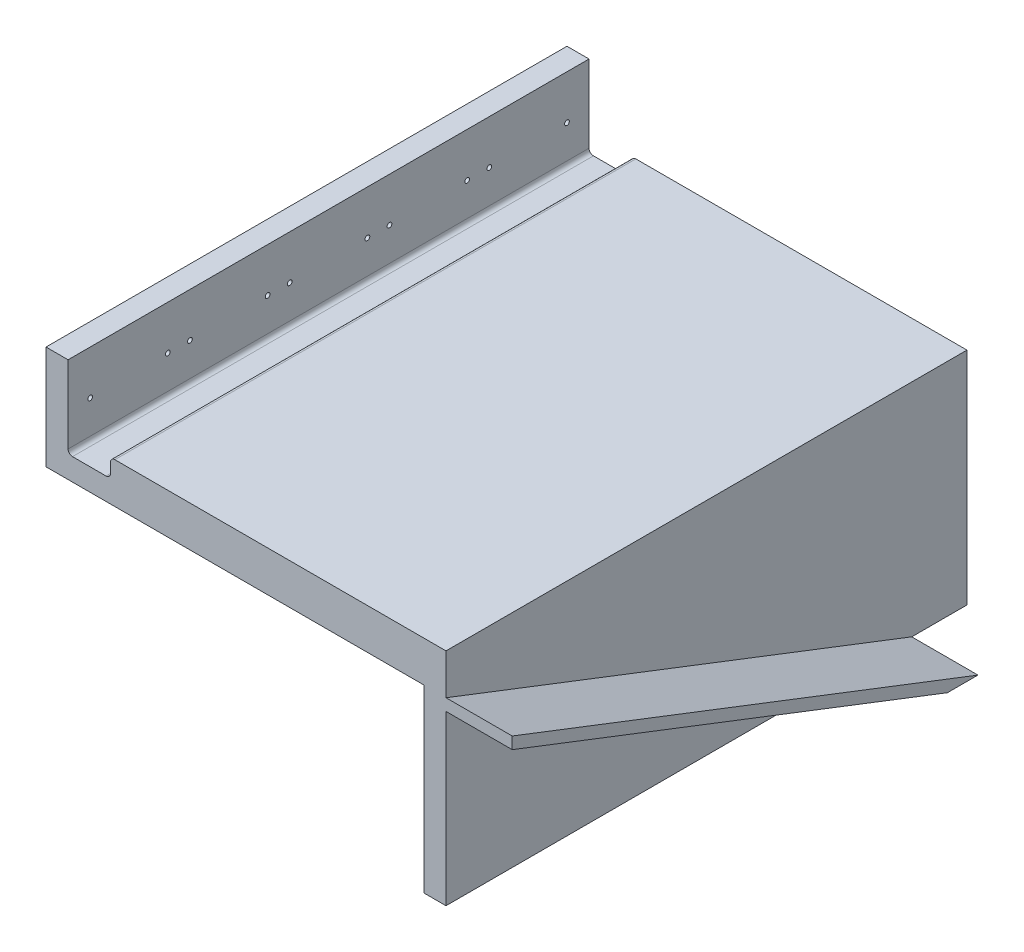
ISO-10303-21;
HEADER;
FILE_DESCRIPTION(('STEP AP214'),'2;1');
FILE_NAME('part.step','',(''),(''),'','','');
FILE_SCHEMA(('AUTOMOTIVE_DESIGN { 1 0 10303 214 1 1 1 1 }'));
ENDSEC;
DATA;
#1=APPLICATION_CONTEXT('core data for automotive mechanical design processes');
#2=APPLICATION_PROTOCOL_DEFINITION('international standard','automotive_design',2000,#1);
#3=PRODUCT_CONTEXT('',#1,'mechanical');
#4=PRODUCT('Part','Part','',(#3));
#5=PRODUCT_RELATED_PRODUCT_CATEGORY('part','',(#4));
#6=PRODUCT_DEFINITION_FORMATION('','',#4);
#7=PRODUCT_DEFINITION_CONTEXT('part definition',#1,'design');
#8=PRODUCT_DEFINITION('design','',#6,#7);
#9=PRODUCT_DEFINITION_SHAPE('','',#8);
#10=(LENGTH_UNIT() NAMED_UNIT(*) SI_UNIT(.MILLI.,.METRE.));
#11=(NAMED_UNIT(*) PLANE_ANGLE_UNIT() SI_UNIT($,.RADIAN.));
#12=(NAMED_UNIT(*) SI_UNIT($,.STERADIAN.) SOLID_ANGLE_UNIT());
#13=UNCERTAINTY_MEASURE_WITH_UNIT(LENGTH_MEASURE(1.E-05),#10,'distance_accuracy_value','');
#14=(GEOMETRIC_REPRESENTATION_CONTEXT(3) GLOBAL_UNCERTAINTY_ASSIGNED_CONTEXT((#13)) GLOBAL_UNIT_ASSIGNED_CONTEXT((#10,
#11,#12)) REPRESENTATION_CONTEXT('',''));
#15=CARTESIAN_POINT('',(0.,0.,0.));
#16=DIRECTION('',(0.,0.,1.));
#17=DIRECTION('',(1.,0.,0.));
#18=AXIS2_PLACEMENT_3D('',#15,#16,#17);
#19=CARTESIAN_POINT('',(171.2,-24.7873130780648,236.));
#20=DIRECTION('',(-1.,0.,0.));
#21=DIRECTION('',(0.,0.,1.));
#22=AXIS2_PLACEMENT_3D('',#19,#20,#21);
#23=PLANE('',#22);
#24=DIRECTION('',(0.,-0.360696463988093,-0.932683258596661));
#25=VECTOR('',#24,1.);
#26=CARTESIAN_POINT('',(171.2,-30.1481898322194,236.));
#27=LINE('',#26,#25);
#28=CARTESIAN_POINT('',(171.2,-30.1481898322194,236.));
#29=VERTEX_POINT('',#28);
#30=CARTESIAN_POINT('',(171.2,-106.387313078065,38.8620710187086));
#31=VERTEX_POINT('',#30);
#32=EDGE_CURVE('E191',#29,#31,#27,.T.);
#33=ORIENTED_EDGE('',*,*,#32,.F.);
#34=DIRECTION('',(0.,1.,0.));
#35=VECTOR('',#34,1.);
#36=CARTESIAN_POINT('',(171.2,-24.7873130780648,236.));
#37=LINE('',#36,#35);
#38=CARTESIAN_POINT('',(171.2,-106.387313078065,236.));
#39=VERTEX_POINT('',#38);
#40=EDGE_CURVE('E291',#39,#29,#37,.T.);
#41=ORIENTED_EDGE('',*,*,#40,.F.);
#42=DIRECTION('',(0.,0.,-1.));
#43=VECTOR('',#42,1.);
#44=CARTESIAN_POINT('',(171.2,-106.387313078065,236.));
#45=LINE('',#44,#43);
#46=EDGE_CURVE('E72',#39,#31,#45,.T.);
#47=ORIENTED_EDGE('',*,*,#46,.T.);
#48=EDGE_LOOP('',(#33,#41,#47));
#49=FACE_BOUND('',#48,.T.);
#50=ADVANCED_FACE('F48',(#49),#23,.F.);
#51=DIRECTION('',(0.,0.360696463988093,0.932683258596661));
#52=VECTOR('',#51,1.);
#53=CARTESIAN_POINT('',(171.2,-24.7873130780648,236.));
#54=LINE('',#53,#52);
#55=CARTESIAN_POINT('',(171.2,-106.387313078065,25.));
#56=VERTEX_POINT('',#55);
#57=CARTESIAN_POINT('',(171.2,-24.7873130780648,236.));
#58=VERTEX_POINT('',#57);
#59=EDGE_CURVE('E64',#56,#58,#54,.T.);
#60=ORIENTED_EDGE('',*,*,#59,.F.);
#61=CARTESIAN_POINT('',(171.2,-106.387313078065,0.));
#62=VERTEX_POINT('',#61);
#63=EDGE_CURVE('E211',#56,#62,#45,.T.);
#64=ORIENTED_EDGE('',*,*,#63,.T.);
#65=DIRECTION('',(0.,1.,0.));
#66=VECTOR('',#65,1.);
#67=CARTESIAN_POINT('',(171.2,-24.7873130780648,0.));
#68=LINE('',#67,#66);
#69=CARTESIAN_POINT('',(171.2,-6.38731307806478,0.));
#70=VERTEX_POINT('',#69);
#71=EDGE_CURVE('E318',#62,#70,#68,.T.);
#72=ORIENTED_EDGE('',*,*,#71,.T.);
#73=DIRECTION('',(0.,0.,-1.));
#74=VECTOR('',#73,1.);
#75=CARTESIAN_POINT('',(171.2,-6.38731307806478,236.));
#76=LINE('',#75,#74);
#77=CARTESIAN_POINT('',(171.2,-6.38731307806478,236.));
#78=VERTEX_POINT('',#77);
#79=EDGE_CURVE('E306',#78,#70,#76,.T.);
#80=ORIENTED_EDGE('',*,*,#79,.F.);
#81=EDGE_CURVE('E290',#58,#78,#37,.T.);
#82=ORIENTED_EDGE('',*,*,#81,.F.);
#83=EDGE_LOOP('',(#60,#64,#72,#80,#82));
#84=FACE_BOUND('',#83,.T.);
#85=ADVANCED_FACE('F469',(#84),#23,.F.);
#86=CARTESIAN_POINT('',(0.,0.,236.));
#87=DIRECTION('',(-1.,0.,0.));
#88=DIRECTION('',(0.,0.,1.));
#89=AXIS2_PLACEMENT_3D('',#86,#87,#88);
#90=PLANE('',#89);
#91=CARTESIAN_POINT('',(0.,2.2126869219352,10.));
#92=DIRECTION('',(-1.,0.,0.));
#93=DIRECTION('',(0.,0.,1.));
#94=AXIS2_PLACEMENT_3D('',#91,#92,#93);
#95=CIRCLE('',#94,1.075);
#96=CARTESIAN_POINT('',(0.,2.2126869219352,11.075));
#97=VERTEX_POINT('',#96);
#98=EDGE_CURVE('E271',#97,#97,#95,.T.);
#99=ORIENTED_EDGE('',*,*,#98,.T.);
#100=EDGE_LOOP('',(#99));
#101=FACE_BOUND('',#100,.T.);
#102=CARTESIAN_POINT('',(0.,2.21268692193393,190.8));
#103=DIRECTION('',(-1.,0.,0.));
#104=DIRECTION('',(0.,0.,1.));
#105=AXIS2_PLACEMENT_3D('',#102,#103,#104);
#106=CIRCLE('',#105,1.07500000000001);
#107=CARTESIAN_POINT('',(0.,2.21268692193393,191.875));
#108=VERTEX_POINT('',#107);
#109=EDGE_CURVE('E266',#108,#108,#106,.T.);
#110=ORIENTED_EDGE('',*,*,#109,.T.);
#111=EDGE_LOOP('',(#110));
#112=FACE_BOUND('',#111,.T.);
#113=CARTESIAN_POINT('',(0.,2.21268692193425,180.8));
#114=DIRECTION('',(-1.,0.,0.));
#115=DIRECTION('',(0.,0.,1.));
#116=AXIS2_PLACEMENT_3D('',#113,#114,#115);
#117=CIRCLE('',#116,1.07500000000001);
#118=CARTESIAN_POINT('',(0.,2.21268692193425,181.875));
#119=VERTEX_POINT('',#118);
#120=EDGE_CURVE('E261',#119,#119,#117,.T.);
#121=ORIENTED_EDGE('',*,*,#120,.T.);
#122=EDGE_LOOP('',(#121));
#123=FACE_BOUND('',#122,.T.);
#124=CARTESIAN_POINT('',(0.,2.21268692193425,145.6));
#125=DIRECTION('',(-1.,0.,0.));
#126=DIRECTION('',(0.,0.,1.));
#127=AXIS2_PLACEMENT_3D('',#124,#125,#126);
#128=CIRCLE('',#127,1.07500000000001);
#129=CARTESIAN_POINT('',(0.,2.21268692193425,146.675));
#130=VERTEX_POINT('',#129);
#131=EDGE_CURVE('E256',#130,#130,#128,.T.);
#132=ORIENTED_EDGE('',*,*,#131,.T.);
#133=EDGE_LOOP('',(#132));
#134=FACE_BOUND('',#133,.T.);
#135=CARTESIAN_POINT('',(0.,2.21268692193457,100.4));
#136=DIRECTION('',(-1.,0.,0.));
#137=DIRECTION('',(0.,0.,1.));
#138=AXIS2_PLACEMENT_3D('',#135,#136,#137);
#139=CIRCLE('',#138,1.07499999999999);
#140=CARTESIAN_POINT('',(0.,2.21268692193457,101.475));
#141=VERTEX_POINT('',#140);
#142=EDGE_CURVE('E251',#141,#141,#139,.T.);
#143=ORIENTED_EDGE('',*,*,#142,.T.);
#144=EDGE_LOOP('',(#143));
#145=FACE_BOUND('',#144,.T.);
#146=CARTESIAN_POINT('',(0.,2.21268692193488,90.4));
#147=DIRECTION('',(-1.,0.,0.));
#148=DIRECTION('',(0.,0.,1.));
#149=AXIS2_PLACEMENT_3D('',#146,#147,#148);
#150=CIRCLE('',#149,1.07499999999999);
#151=CARTESIAN_POINT('',(0.,2.21268692193488,91.475));
#152=VERTEX_POINT('',#151);
#153=EDGE_CURVE('E246',#152,#152,#150,.T.);
#154=ORIENTED_EDGE('',*,*,#153,.T.);
#155=EDGE_LOOP('',(#154));
#156=FACE_BOUND('',#155,.T.);
#157=CARTESIAN_POINT('',(0.,2.21268692193457,135.6));
#158=DIRECTION('',(-1.,0.,0.));
#159=DIRECTION('',(0.,0.,1.));
#160=AXIS2_PLACEMENT_3D('',#157,#158,#159);
#161=CIRCLE('',#160,1.07500000000001);
#162=CARTESIAN_POINT('',(0.,2.21268692193457,136.675));
#163=VERTEX_POINT('',#162);
#164=EDGE_CURVE('E241',#163,#163,#161,.T.);
#165=ORIENTED_EDGE('',*,*,#164,.T.);
#166=EDGE_LOOP('',(#165));
#167=FACE_BOUND('',#166,.T.);
#168=CARTESIAN_POINT('',(0.,2.21268692193488,55.2));
#169=DIRECTION('',(-1.,0.,0.));
#170=DIRECTION('',(0.,0.,1.));
#171=AXIS2_PLACEMENT_3D('',#168,#169,#170);
#172=CIRCLE('',#171,1.075);
#173=CARTESIAN_POINT('',(0.,2.21268692193488,56.275));
#174=VERTEX_POINT('',#173);
#175=EDGE_CURVE('E236',#174,#174,#172,.T.);
#176=ORIENTED_EDGE('',*,*,#175,.T.);
#177=EDGE_LOOP('',(#176));
#178=FACE_BOUND('',#177,.T.);
#179=CARTESIAN_POINT('',(0.,2.2126869219352,45.2));
#180=DIRECTION('',(-1.,0.,0.));
#181=DIRECTION('',(0.,0.,1.));
#182=AXIS2_PLACEMENT_3D('',#179,#180,#181);
#183=CIRCLE('',#182,1.075);
#184=CARTESIAN_POINT('',(0.,2.2126869219352,46.275));
#185=VERTEX_POINT('',#184);
#186=EDGE_CURVE('E231',#185,#185,#183,.T.);
#187=ORIENTED_EDGE('',*,*,#186,.T.);
#188=EDGE_LOOP('',(#187));
#189=FACE_BOUND('',#188,.T.);
#190=CARTESIAN_POINT('',(0.,2.21268692193393,226.));
#191=DIRECTION('',(-1.,0.,0.));
#192=DIRECTION('',(0.,0.,1.));
#193=AXIS2_PLACEMENT_3D('',#190,#191,#192);
#194=CIRCLE('',#193,1.07500000000001);
#195=CARTESIAN_POINT('',(0.,2.21268692193393,227.075));
#196=VERTEX_POINT('',#195);
#197=EDGE_CURVE('E226',#196,#196,#194,.T.);
#198=ORIENTED_EDGE('',*,*,#197,.T.);
#199=EDGE_LOOP('',(#198));
#200=FACE_BOUND('',#199,.T.);
#201=DIRECTION('',(0.,1.,0.));
#202=VECTOR('',#201,1.);
#203=CARTESIAN_POINT('',(0.,-14.7873130780648,236.));
#204=LINE('',#203,#202);
#205=CARTESIAN_POINT('',(0.,-12.7873130780648,236.));
#206=VERTEX_POINT('',#205);
#207=CARTESIAN_POINT('',(0.,22.2126869219352,236.));
#208=VERTEX_POINT('',#207);
#209=EDGE_CURVE('E276',#206,#208,#204,.T.);
#210=ORIENTED_EDGE('',*,*,#209,.F.);
#211=DIRECTION('',(0.,0.,-1.));
#212=VECTOR('',#211,1.);
#213=CARTESIAN_POINT('',(0.,-12.7873130780648,0.));
#214=LINE('',#213,#212);
#215=CARTESIAN_POINT('',(0.,-12.7873130780648,0.));
#216=VERTEX_POINT('',#215);
#217=EDGE_CURVE('E401',#206,#216,#214,.T.);
#218=ORIENTED_EDGE('',*,*,#217,.T.);
#219=DIRECTION('',(0.,1.,0.));
#220=VECTOR('',#219,1.);
#221=CARTESIAN_POINT('',(0.,0.,0.));
#222=LINE('',#221,#220);
#223=CARTESIAN_POINT('',(0.,22.2126869219352,0.));
#224=VERTEX_POINT('',#223);
#225=EDGE_CURVE('E275',#216,#224,#222,.T.);
#226=ORIENTED_EDGE('',*,*,#225,.T.);
#227=DIRECTION('',(0.,0.,-1.));
#228=VECTOR('',#227,1.);
#229=CARTESIAN_POINT('',(0.,22.2126869219352,236.));
#230=LINE('',#229,#228);
#231=EDGE_CURVE('E342',#208,#224,#230,.T.);
#232=ORIENTED_EDGE('',*,*,#231,.F.);
#233=EDGE_LOOP('',(#210,#218,#226,#232));
#234=FACE_BOUND('',#233,.T.);
#235=ADVANCED_FACE('F429',(#101,#112,#123,#134,#145,#156,#167,#178,#189,#200,#234),#90,.F.);
#236=CARTESIAN_POINT('',(0.,22.2126869219352,236.));
#237=DIRECTION('',(0.,-1.,0.));
#238=DIRECTION('',(0.,0.,-1.));
#239=AXIS2_PLACEMENT_3D('',#236,#237,#238);
#240=PLANE('',#239);
#241=DIRECTION('',(-1.,0.,0.));
#242=VECTOR('',#241,1.);
#243=CARTESIAN_POINT('',(0.,22.2126869219352,0.));
#244=LINE('',#243,#242);
#245=CARTESIAN_POINT('',(-10.,22.2126869219352,0.));
#246=VERTEX_POINT('',#245);
#247=EDGE_CURVE('E309',#224,#246,#244,.T.);
#248=ORIENTED_EDGE('',*,*,#247,.T.);
#249=DIRECTION('',(0.,0.,-1.));
#250=VECTOR('',#249,1.);
#251=CARTESIAN_POINT('',(-10.,22.2126869219352,236.));
#252=LINE('',#251,#250);
#253=CARTESIAN_POINT('',(-10.,22.2126869219352,236.));
#254=VERTEX_POINT('',#253);
#255=EDGE_CURVE('E338',#254,#246,#252,.T.);
#256=ORIENTED_EDGE('',*,*,#255,.F.);
#257=DIRECTION('',(-1.,0.,0.));
#258=VECTOR('',#257,1.);
#259=CARTESIAN_POINT('',(0.,22.2126869219352,236.));
#260=LINE('',#259,#258);
#261=EDGE_CURVE('E279',#208,#254,#260,.T.);
#262=ORIENTED_EDGE('',*,*,#261,.F.);
#263=ORIENTED_EDGE('',*,*,#231,.T.);
#264=EDGE_LOOP('',(#248,#256,#262,#263));
#265=FACE_BOUND('',#264,.T.);
#266=ADVANCED_FACE('F433',(#265),#240,.F.);
#267=CARTESIAN_POINT('',(-10.,22.2126869219352,236.));
#268=DIRECTION('',(1.,0.,0.));
#269=DIRECTION('',(0.,1.,0.));
#270=AXIS2_PLACEMENT_3D('',#267,#268,#269);
#271=PLANE('',#270);
#272=CARTESIAN_POINT('',(-9.99999999999999,2.2126869219352,10.));
#273=DIRECTION('',(1.,0.,0.));
#274=DIRECTION('',(0.,1.,0.));
#275=AXIS2_PLACEMENT_3D('',#272,#273,#274);
#276=CIRCLE('',#275,1.075);
#277=CARTESIAN_POINT('',(-9.99999999999999,3.2876869219352,10.));
#278=VERTEX_POINT('',#277);
#279=EDGE_CURVE('E270',#278,#278,#276,.T.);
#280=ORIENTED_EDGE('',*,*,#279,.T.);
#281=EDGE_LOOP('',(#280));
#282=FACE_BOUND('',#281,.T.);
#283=CARTESIAN_POINT('',(-9.99999999999999,2.21268692193393,190.8));
#284=DIRECTION('',(1.,0.,0.));
#285=DIRECTION('',(0.,1.,0.));
#286=AXIS2_PLACEMENT_3D('',#283,#284,#285);
#287=CIRCLE('',#286,1.07500000000001);
#288=CARTESIAN_POINT('',(-9.99999999999999,3.28768692193394,190.8));
#289=VERTEX_POINT('',#288);
#290=EDGE_CURVE('E265',#289,#289,#287,.T.);
#291=ORIENTED_EDGE('',*,*,#290,.T.);
#292=EDGE_LOOP('',(#291));
#293=FACE_BOUND('',#292,.T.);
#294=CARTESIAN_POINT('',(-9.99999999999999,2.21268692193425,180.8));
#295=DIRECTION('',(1.,0.,0.));
#296=DIRECTION('',(0.,1.,0.));
#297=AXIS2_PLACEMENT_3D('',#294,#295,#296);
#298=CIRCLE('',#297,1.07500000000001);
#299=CARTESIAN_POINT('',(-9.99999999999999,3.28768692193426,180.8));
#300=VERTEX_POINT('',#299);
#301=EDGE_CURVE('E260',#300,#300,#298,.T.);
#302=ORIENTED_EDGE('',*,*,#301,.T.);
#303=EDGE_LOOP('',(#302));
#304=FACE_BOUND('',#303,.T.);
#305=CARTESIAN_POINT('',(-9.99999999999999,2.21268692193425,145.6));
#306=DIRECTION('',(1.,0.,0.));
#307=DIRECTION('',(0.,1.,0.));
#308=AXIS2_PLACEMENT_3D('',#305,#306,#307);
#309=CIRCLE('',#308,1.07500000000001);
#310=CARTESIAN_POINT('',(-9.99999999999999,3.28768692193426,145.6));
#311=VERTEX_POINT('',#310);
#312=EDGE_CURVE('E255',#311,#311,#309,.T.);
#313=ORIENTED_EDGE('',*,*,#312,.T.);
#314=EDGE_LOOP('',(#313));
#315=FACE_BOUND('',#314,.T.);
#316=CARTESIAN_POINT('',(-9.99999999999999,2.21268692193457,100.4));
#317=DIRECTION('',(1.,0.,0.));
#318=DIRECTION('',(0.,1.,0.));
#319=AXIS2_PLACEMENT_3D('',#316,#317,#318);
#320=CIRCLE('',#319,1.07499999999999);
#321=CARTESIAN_POINT('',(-9.99999999999999,3.28768692193456,100.4));
#322=VERTEX_POINT('',#321);
#323=EDGE_CURVE('E250',#322,#322,#320,.T.);
#324=ORIENTED_EDGE('',*,*,#323,.T.);
#325=EDGE_LOOP('',(#324));
#326=FACE_BOUND('',#325,.T.);
#327=CARTESIAN_POINT('',(-9.99999999999999,2.21268692193488,90.4));
#328=DIRECTION('',(1.,0.,0.));
#329=DIRECTION('',(0.,1.,0.));
#330=AXIS2_PLACEMENT_3D('',#327,#328,#329);
#331=CIRCLE('',#330,1.07499999999999);
#332=CARTESIAN_POINT('',(-9.99999999999999,3.28768692193487,90.4));
#333=VERTEX_POINT('',#332);
#334=EDGE_CURVE('E245',#333,#333,#331,.T.);
#335=ORIENTED_EDGE('',*,*,#334,.T.);
#336=EDGE_LOOP('',(#335));
#337=FACE_BOUND('',#336,.T.);
#338=CARTESIAN_POINT('',(-9.99999999999999,2.21268692193457,135.6));
#339=DIRECTION('',(1.,0.,0.));
#340=DIRECTION('',(0.,1.,0.));
#341=AXIS2_PLACEMENT_3D('',#338,#339,#340);
#342=CIRCLE('',#341,1.07500000000001);
#343=CARTESIAN_POINT('',(-9.99999999999999,3.28768692193457,135.6));
#344=VERTEX_POINT('',#343);
#345=EDGE_CURVE('E240',#344,#344,#342,.T.);
#346=ORIENTED_EDGE('',*,*,#345,.T.);
#347=EDGE_LOOP('',(#346));
#348=FACE_BOUND('',#347,.T.);
#349=CARTESIAN_POINT('',(-9.99999999999999,2.21268692193488,55.2));
#350=DIRECTION('',(1.,0.,0.));
#351=DIRECTION('',(0.,1.,0.));
#352=AXIS2_PLACEMENT_3D('',#349,#350,#351);
#353=CIRCLE('',#352,1.075);
#354=CARTESIAN_POINT('',(-9.99999999999999,3.28768692193488,55.2));
#355=VERTEX_POINT('',#354);
#356=EDGE_CURVE('E235',#355,#355,#353,.T.);
#357=ORIENTED_EDGE('',*,*,#356,.T.);
#358=EDGE_LOOP('',(#357));
#359=FACE_BOUND('',#358,.T.);
#360=CARTESIAN_POINT('',(-9.99999999999999,2.2126869219352,45.2));
#361=DIRECTION('',(1.,0.,0.));
#362=DIRECTION('',(0.,1.,0.));
#363=AXIS2_PLACEMENT_3D('',#360,#361,#362);
#364=CIRCLE('',#363,1.075);
#365=CARTESIAN_POINT('',(-9.99999999999999,3.2876869219352,45.2));
#366=VERTEX_POINT('',#365);
#367=EDGE_CURVE('E230',#366,#366,#364,.T.);
#368=ORIENTED_EDGE('',*,*,#367,.T.);
#369=EDGE_LOOP('',(#368));
#370=FACE_BOUND('',#369,.T.);
#371=CARTESIAN_POINT('',(-9.99999999999999,2.21268692193393,226.));
#372=DIRECTION('',(1.,0.,0.));
#373=DIRECTION('',(0.,1.,0.));
#374=AXIS2_PLACEMENT_3D('',#371,#372,#373);
#375=CIRCLE('',#374,1.07500000000001);
#376=CARTESIAN_POINT('',(-9.99999999999999,3.28768692193394,226.));
#377=VERTEX_POINT('',#376);
#378=EDGE_CURVE('E225',#377,#377,#375,.T.);
#379=ORIENTED_EDGE('',*,*,#378,.T.);
#380=EDGE_LOOP('',(#379));
#381=FACE_BOUND('',#380,.T.);
#382=DIRECTION('',(0.,-1.,0.));
#383=VECTOR('',#382,1.);
#384=CARTESIAN_POINT('',(-10.,22.2126869219352,0.));
#385=LINE('',#384,#383);
#386=CARTESIAN_POINT('',(-9.99999999999999,-24.7873130780648,0.));
#387=VERTEX_POINT('',#386);
#388=EDGE_CURVE('E312',#246,#387,#385,.T.);
#389=ORIENTED_EDGE('',*,*,#388,.T.);
#390=DIRECTION('',(0.,0.,-1.));
#391=VECTOR('',#390,1.);
#392=CARTESIAN_POINT('',(-9.99999999999999,-24.7873130780648,236.));
#393=LINE('',#392,#391);
#394=CARTESIAN_POINT('',(-9.99999999999999,-24.7873130780648,236.));
#395=VERTEX_POINT('',#394);
#396=EDGE_CURVE('E334',#395,#387,#393,.T.);
#397=ORIENTED_EDGE('',*,*,#396,.F.);
#398=DIRECTION('',(0.,-1.,0.));
#399=VECTOR('',#398,1.);
#400=CARTESIAN_POINT('',(-10.,22.2126869219352,236.));
#401=LINE('',#400,#399);
#402=EDGE_CURVE('E283',#254,#395,#401,.T.);
#403=ORIENTED_EDGE('',*,*,#402,.F.);
#404=ORIENTED_EDGE('',*,*,#255,.T.);
#405=EDGE_LOOP('',(#389,#397,#403,#404));
#406=FACE_BOUND('',#405,.T.);
#407=ADVANCED_FACE('F439',(#282,#293,#304,#315,#326,#337,#348,#359,#370,#381,#406),#271,.F.);
#408=CARTESIAN_POINT('',(-9.99999999999999,-24.7873130780648,236.));
#409=DIRECTION('',(0.,1.,0.));
#410=DIRECTION('',(0.,0.,1.));
#411=AXIS2_PLACEMENT_3D('',#408,#409,#410);
#412=PLANE('',#411);
#413=DIRECTION('',(1.,0.,0.));
#414=VECTOR('',#413,1.);
#415=CARTESIAN_POINT('',(-9.99999999999999,-24.7873130780648,0.));
#416=LINE('',#415,#414);
#417=CARTESIAN_POINT('',(161.2,-24.7873130780648,0.));
#418=VERTEX_POINT('',#417);
#419=EDGE_CURVE('E315',#387,#418,#416,.T.);
#420=ORIENTED_EDGE('',*,*,#419,.T.);
#421=DIRECTION('',(0.,0.,1.));
#422=VECTOR('',#421,1.);
#423=CARTESIAN_POINT('',(161.2,-24.7873130780648,236.));
#424=LINE('',#423,#422);
#425=CARTESIAN_POINT('',(161.2,-24.7873130780648,236.));
#426=VERTEX_POINT('',#425);
#427=EDGE_CURVE('E222',#418,#426,#424,.T.);
#428=ORIENTED_EDGE('',*,*,#427,.T.);
#429=DIRECTION('',(1.,0.,0.));
#430=VECTOR('',#429,1.);
#431=CARTESIAN_POINT('',(-9.99999999999999,-24.7873130780648,236.));
#432=LINE('',#431,#430);
#433=EDGE_CURVE('E286',#395,#426,#432,.T.);
#434=ORIENTED_EDGE('',*,*,#433,.F.);
#435=ORIENTED_EDGE('',*,*,#396,.T.);
#436=EDGE_LOOP('',(#420,#428,#434,#435));
#437=FACE_BOUND('',#436,.T.);
#438=ADVANCED_FACE('F443',(#437),#412,.F.);
#439=CARTESIAN_POINT('',(171.2,-6.38731307806478,236.));
#440=DIRECTION('',(0.,-1.,0.));
#441=DIRECTION('',(1.,0.,0.));
#442=AXIS2_PLACEMENT_3D('',#439,#440,#441);
#443=PLANE('',#442);
#444=DIRECTION('',(0.,0.,-1.));
#445=VECTOR('',#444,1.);
#446=CARTESIAN_POINT('',(21.2,-6.38731307806479,236.));
#447=LINE('',#446,#445);
#448=CARTESIAN_POINT('',(21.2,-6.38731307806479,0.));
#449=VERTEX_POINT('',#448);
#450=CARTESIAN_POINT('',(21.2,-6.38731307806479,236.));
#451=VERTEX_POINT('',#450);
#452=EDGE_CURVE('E387',#449,#451,#447,.F.);
#453=ORIENTED_EDGE('',*,*,#452,.T.);
#454=DIRECTION('',(-1.,0.,0.));
#455=VECTOR('',#454,1.);
#456=CARTESIAN_POINT('',(171.2,-6.38731307806478,236.));
#457=LINE('',#456,#455);
#458=EDGE_CURVE('E295',#78,#451,#457,.T.);
#459=ORIENTED_EDGE('',*,*,#458,.F.);
#460=ORIENTED_EDGE('',*,*,#79,.T.);
#461=DIRECTION('',(-1.,0.,0.));
#462=VECTOR('',#461,1.);
#463=CARTESIAN_POINT('',(171.2,-6.38731307806478,0.));
#464=LINE('',#463,#462);
#465=EDGE_CURVE('E321',#70,#449,#464,.T.);
#466=ORIENTED_EDGE('',*,*,#465,.T.);
#467=EDGE_LOOP('',(#453,#459,#460,#466));
#468=FACE_BOUND('',#467,.T.);
#469=ADVANCED_FACE('F471',(#468),#443,.F.);
#470=CARTESIAN_POINT('',(19.2,-6.38731307806479,236.));
#471=DIRECTION('',(1.,0.,0.));
#472=DIRECTION('',(0.,1.,0.));
#473=AXIS2_PLACEMENT_3D('',#470,#471,#472);
#474=PLANE('',#473);
#475=DIRECTION('',(0.,-1.,0.));
#476=VECTOR('',#475,1.);
#477=CARTESIAN_POINT('',(19.2,-6.38731307806479,236.));
#478=LINE('',#477,#476);
#479=CARTESIAN_POINT('',(19.2,-8.38731307806479,236.));
#480=VERTEX_POINT('',#479);
#481=CARTESIAN_POINT('',(19.2,-12.7873130780648,236.));
#482=VERTEX_POINT('',#481);
#483=EDGE_CURVE('E298',#480,#482,#478,.T.);
#484=ORIENTED_EDGE('',*,*,#483,.F.);
#485=DIRECTION('',(0.,0.,-1.));
#486=VECTOR('',#485,1.);
#487=CARTESIAN_POINT('',(19.2,-8.38731307806479,236.));
#488=LINE('',#487,#486);
#489=CARTESIAN_POINT('',(19.2,-8.38731307806479,0.));
#490=VERTEX_POINT('',#489);
#491=EDGE_CURVE('E379',#480,#490,#488,.T.);
#492=ORIENTED_EDGE('',*,*,#491,.T.);
#493=DIRECTION('',(0.,-1.,0.));
#494=VECTOR('',#493,1.);
#495=CARTESIAN_POINT('',(19.2,-6.38731307806479,0.));
#496=LINE('',#495,#494);
#497=CARTESIAN_POINT('',(19.2,-12.7873130780648,0.));
#498=VERTEX_POINT('',#497);
#499=EDGE_CURVE('E324',#490,#498,#496,.T.);
#500=ORIENTED_EDGE('',*,*,#499,.T.);
#501=DIRECTION('',(0.,0.,-1.));
#502=VECTOR('',#501,1.);
#503=CARTESIAN_POINT('',(19.2,-12.7873130780648,236.));
#504=LINE('',#503,#502);
#505=EDGE_CURVE('E346',#498,#482,#504,.F.);
#506=ORIENTED_EDGE('',*,*,#505,.T.);
#507=EDGE_LOOP('',(#484,#492,#500,#506));
#508=FACE_BOUND('',#507,.T.);
#509=ADVANCED_FACE('F480',(#508),#474,.F.);
#510=CARTESIAN_POINT('',(19.2,-14.7873130780648,236.));
#511=DIRECTION('',(0.,-1.,0.));
#512=DIRECTION('',(1.,0.,0.));
#513=AXIS2_PLACEMENT_3D('',#510,#511,#512);
#514=PLANE('',#513);
#515=DIRECTION('',(-1.,0.,0.));
#516=VECTOR('',#515,1.);
#517=CARTESIAN_POINT('',(19.2,-14.7873130780648,236.));
#518=LINE('',#517,#516);
#519=CARTESIAN_POINT('',(17.2,-14.7873130780648,236.));
#520=VERTEX_POINT('',#519);
#521=CARTESIAN_POINT('',(2.,-14.7873130780648,236.));
#522=VERTEX_POINT('',#521);
#523=EDGE_CURVE('E302',#520,#522,#518,.T.);
#524=ORIENTED_EDGE('',*,*,#523,.F.);
#525=DIRECTION('',(0.,0.,-1.));
#526=VECTOR('',#525,1.);
#527=CARTESIAN_POINT('',(17.2,-14.7873130780648,0.));
#528=LINE('',#527,#526);
#529=CARTESIAN_POINT('',(17.2,-14.7873130780648,0.));
#530=VERTEX_POINT('',#529);
#531=EDGE_CURVE('E397',#520,#530,#528,.T.);
#532=ORIENTED_EDGE('',*,*,#531,.T.);
#533=DIRECTION('',(-1.,0.,0.));
#534=VECTOR('',#533,1.);
#535=CARTESIAN_POINT('',(19.2,-14.7873130780648,0.));
#536=LINE('',#535,#534);
#537=CARTESIAN_POINT('',(2.,-14.7873130780648,0.));
#538=VERTEX_POINT('',#537);
#539=EDGE_CURVE('E280',#530,#538,#536,.T.);
#540=ORIENTED_EDGE('',*,*,#539,.T.);
#541=DIRECTION('',(0.,0.,-1.));
#542=VECTOR('',#541,1.);
#543=CARTESIAN_POINT('',(2.,-14.7873130780648,236.));
#544=LINE('',#543,#542);
#545=EDGE_CURVE('E394',#538,#522,#544,.F.);
#546=ORIENTED_EDGE('',*,*,#545,.T.);
#547=EDGE_LOOP('',(#524,#532,#540,#546));
#548=FACE_BOUND('',#547,.T.);
#549=ADVANCED_FACE('F421',(#548),#514,.F.);
#550=CARTESIAN_POINT('',(0.,0.,236.));
#551=DIRECTION('',(0.,0.,1.));
#552=DIRECTION('',(1.,0.,0.));
#553=AXIS2_PLACEMENT_3D('',#550,#551,#552);
#554=PLANE('',#553);
#555=ORIENTED_EDGE('',*,*,#433,.T.);
#556=DIRECTION('',(0.,1.,0.));
#557=VECTOR('',#556,1.);
#558=CARTESIAN_POINT('',(161.2,-442.599082471548,236.));
#559=LINE('',#558,#557);
#560=CARTESIAN_POINT('',(161.2,-106.387313078065,236.));
#561=VERTEX_POINT('',#560);
#562=EDGE_CURVE('E198',#561,#426,#559,.T.);
#563=ORIENTED_EDGE('',*,*,#562,.F.);
#564=DIRECTION('',(1.,0.,0.));
#565=VECTOR('',#564,1.);
#566=CARTESIAN_POINT('',(171.2,-106.387313078065,236.));
#567=LINE('',#566,#565);
#568=EDGE_CURVE('E212',#561,#39,#567,.T.);
#569=ORIENTED_EDGE('',*,*,#568,.T.);
#570=ORIENTED_EDGE('',*,*,#40,.T.);
#571=DIRECTION('',(-1.,0.,0.));
#572=VECTOR('',#571,1.);
#573=CARTESIAN_POINT('',(201.2,-30.1481898322194,236.));
#574=LINE('',#573,#572);
#575=CARTESIAN_POINT('',(201.2,-30.1481898322194,236.));
#576=VERTEX_POINT('',#575);
#577=EDGE_CURVE('E450',#576,#29,#574,.T.);
#578=ORIENTED_EDGE('',*,*,#577,.F.);
#579=DIRECTION('',(0.,-1.,0.));
#580=VECTOR('',#579,1.);
#581=CARTESIAN_POINT('',(201.2,-24.7873130780648,236.));
#582=LINE('',#581,#580);
#583=CARTESIAN_POINT('',(201.2,-24.7873130780648,236.));
#584=VERTEX_POINT('',#583);
#585=EDGE_CURVE('E184',#584,#576,#582,.T.);
#586=ORIENTED_EDGE('',*,*,#585,.F.);
#587=DIRECTION('',(-1.,0.,0.));
#588=VECTOR('',#587,1.);
#589=CARTESIAN_POINT('',(201.2,-24.7873130780648,236.));
#590=LINE('',#589,#588);
#591=EDGE_CURVE('E200',#584,#58,#590,.T.);
#592=ORIENTED_EDGE('',*,*,#591,.T.);
#593=ORIENTED_EDGE('',*,*,#81,.T.);
#594=ORIENTED_EDGE('',*,*,#458,.T.);
#595=CARTESIAN_POINT('',(21.2,-8.38731307806479,236.));
#596=DIRECTION('',(0.,0.,1.));
#597=DIRECTION('',(1.,0.,0.));
#598=AXIS2_PLACEMENT_3D('',#595,#596,#597);
#599=CIRCLE('',#598,2.);
#600=EDGE_CURVE('E391',#451,#480,#599,.T.);
#601=ORIENTED_EDGE('',*,*,#600,.T.);
#602=ORIENTED_EDGE('',*,*,#483,.T.);
#603=CARTESIAN_POINT('',(17.2,-12.7873130780648,236.));
#604=DIRECTION('',(0.,0.,1.));
#605=DIRECTION('',(1.,0.,0.));
#606=AXIS2_PLACEMENT_3D('',#603,#604,#605);
#607=CIRCLE('',#606,2.);
#608=EDGE_CURVE('E408',#482,#520,#607,.F.);
#609=ORIENTED_EDGE('',*,*,#608,.T.);
#610=ORIENTED_EDGE('',*,*,#523,.T.);
#611=CARTESIAN_POINT('',(2.,-12.7873130780648,236.));
#612=DIRECTION('',(0.,0.,1.));
#613=DIRECTION('',(1.,0.,0.));
#614=AXIS2_PLACEMENT_3D('',#611,#612,#613);
#615=CIRCLE('',#614,2.);
#616=EDGE_CURVE('E13',#522,#206,#615,.F.);
#617=ORIENTED_EDGE('',*,*,#616,.T.);
#618=ORIENTED_EDGE('',*,*,#209,.T.);
#619=ORIENTED_EDGE('',*,*,#261,.T.);
#620=ORIENTED_EDGE('',*,*,#402,.T.);
#621=EDGE_LOOP('',(#555,#563,#569,#570,#578,#586,#592,#593,#594,#601,#602,#609,#610,#617,#618,
#619,#620));
#622=FACE_BOUND('',#621,.T.);
#623=ADVANCED_FACE('F426',(#622),#554,.T.);
#624=CARTESIAN_POINT('',(0.,0.,0.));
#625=DIRECTION('',(0.,0.,1.));
#626=DIRECTION('',(1.,0.,0.));
#627=AXIS2_PLACEMENT_3D('',#624,#625,#626);
#628=PLANE('',#627);
#629=CARTESIAN_POINT('',(21.2,-8.38731307806479,0.));
#630=DIRECTION('',(0.,0.,1.));
#631=DIRECTION('',(1.,0.,0.));
#632=AXIS2_PLACEMENT_3D('',#629,#630,#631);
#633=CIRCLE('',#632,2.);
#634=EDGE_CURVE('E383',#490,#449,#633,.F.);
#635=ORIENTED_EDGE('',*,*,#634,.T.);
#636=ORIENTED_EDGE('',*,*,#465,.F.);
#637=ORIENTED_EDGE('',*,*,#71,.F.);
#638=DIRECTION('',(-1.,0.,0.));
#639=VECTOR('',#638,1.);
#640=CARTESIAN_POINT('',(161.2,-106.387313078065,0.));
#641=LINE('',#640,#639);
#642=CARTESIAN_POINT('',(161.2,-106.387313078065,0.));
#643=VERTEX_POINT('',#642);
#644=EDGE_CURVE('E204',#62,#643,#641,.T.);
#645=ORIENTED_EDGE('',*,*,#644,.T.);
#646=DIRECTION('',(0.,1.,0.));
#647=VECTOR('',#646,1.);
#648=CARTESIAN_POINT('',(161.2,-442.599082471548,0.));
#649=LINE('',#648,#647);
#650=EDGE_CURVE('E208',#643,#418,#649,.T.);
#651=ORIENTED_EDGE('',*,*,#650,.T.);
#652=ORIENTED_EDGE('',*,*,#419,.F.);
#653=ORIENTED_EDGE('',*,*,#388,.F.);
#654=ORIENTED_EDGE('',*,*,#247,.F.);
#655=ORIENTED_EDGE('',*,*,#225,.F.);
#656=CARTESIAN_POINT('',(2.,-12.7873130780648,0.));
#657=DIRECTION('',(0.,0.,1.));
#658=DIRECTION('',(1.,0.,0.));
#659=AXIS2_PLACEMENT_3D('',#656,#657,#658);
#660=CIRCLE('',#659,2.);
#661=EDGE_CURVE('E57',#216,#538,#660,.T.);
#662=ORIENTED_EDGE('',*,*,#661,.T.);
#663=ORIENTED_EDGE('',*,*,#539,.F.);
#664=CARTESIAN_POINT('',(17.2,-12.7873130780648,0.));
#665=DIRECTION('',(0.,0.,1.));
#666=DIRECTION('',(1.,0.,0.));
#667=AXIS2_PLACEMENT_3D('',#664,#665,#666);
#668=CIRCLE('',#667,2.);
#669=EDGE_CURVE('E405',#530,#498,#668,.T.);
#670=ORIENTED_EDGE('',*,*,#669,.T.);
#671=ORIENTED_EDGE('',*,*,#499,.F.);
#672=EDGE_LOOP('',(#635,#636,#637,#645,#651,#652,#653,#654,#655,#662,#663,#670,#671));
#673=FACE_BOUND('',#672,.T.);
#674=ADVANCED_FACE('F414',(#673),#628,.F.);
#675=CARTESIAN_POINT('',(-85.,2.21268692193393,226.));
#676=DIRECTION('',(1.,0.,0.));
#677=DIRECTION('',(0.,0.,-1.));
#678=AXIS2_PLACEMENT_3D('',#675,#676,#677);
#679=CYLINDRICAL_SURFACE('',#678,1.07500000000001);
#680=ORIENTED_EDGE('',*,*,#378,.F.);
#681=EDGE_LOOP('',(#680));
#682=FACE_BOUND('',#681,.T.);
#683=ORIENTED_EDGE('',*,*,#197,.F.);
#684=EDGE_LOOP('',(#683));
#685=FACE_BOUND('',#684,.T.);
#686=ADVANCED_FACE('F534',(#682,#685),#679,.F.);
#687=CARTESIAN_POINT('',(-85.,2.2126869219352,45.2));
#688=DIRECTION('',(1.,0.,0.));
#689=DIRECTION('',(0.,0.,-1.));
#690=AXIS2_PLACEMENT_3D('',#687,#688,#689);
#691=CYLINDRICAL_SURFACE('',#690,1.075);
#692=ORIENTED_EDGE('',*,*,#367,.F.);
#693=EDGE_LOOP('',(#692));
#694=FACE_BOUND('',#693,.T.);
#695=ORIENTED_EDGE('',*,*,#186,.F.);
#696=EDGE_LOOP('',(#695));
#697=FACE_BOUND('',#696,.T.);
#698=ADVANCED_FACE('F536',(#694,#697),#691,.F.);
#699=CARTESIAN_POINT('',(-85.,2.21268692193488,55.2));
#700=DIRECTION('',(1.,0.,0.));
#701=DIRECTION('',(0.,0.,-1.));
#702=AXIS2_PLACEMENT_3D('',#699,#700,#701);
#703=CYLINDRICAL_SURFACE('',#702,1.075);
#704=ORIENTED_EDGE('',*,*,#356,.F.);
#705=EDGE_LOOP('',(#704));
#706=FACE_BOUND('',#705,.T.);
#707=ORIENTED_EDGE('',*,*,#175,.F.);
#708=EDGE_LOOP('',(#707));
#709=FACE_BOUND('',#708,.T.);
#710=ADVANCED_FACE('F542',(#706,#709),#703,.F.);
#711=CARTESIAN_POINT('',(-85.,2.21268692193457,135.6));
#712=DIRECTION('',(1.,0.,0.));
#713=DIRECTION('',(0.,0.,-1.));
#714=AXIS2_PLACEMENT_3D('',#711,#712,#713);
#715=CYLINDRICAL_SURFACE('',#714,1.07500000000001);
#716=ORIENTED_EDGE('',*,*,#345,.F.);
#717=EDGE_LOOP('',(#716));
#718=FACE_BOUND('',#717,.T.);
#719=ORIENTED_EDGE('',*,*,#164,.F.);
#720=EDGE_LOOP('',(#719));
#721=FACE_BOUND('',#720,.T.);
#722=ADVANCED_FACE('F658',(#718,#721),#715,.F.);
#723=CARTESIAN_POINT('',(-85.,2.21268692193488,90.4));
#724=DIRECTION('',(1.,0.,0.));
#725=DIRECTION('',(0.,0.,-1.));
#726=AXIS2_PLACEMENT_3D('',#723,#724,#725);
#727=CYLINDRICAL_SURFACE('',#726,1.07499999999999);
#728=ORIENTED_EDGE('',*,*,#334,.F.);
#729=EDGE_LOOP('',(#728));
#730=FACE_BOUND('',#729,.T.);
#731=ORIENTED_EDGE('',*,*,#153,.F.);
#732=EDGE_LOOP('',(#731));
#733=FACE_BOUND('',#732,.T.);
#734=ADVANCED_FACE('F550',(#730,#733),#727,.F.);
#735=CARTESIAN_POINT('',(-85.,2.21268692193457,100.4));
#736=DIRECTION('',(1.,0.,0.));
#737=DIRECTION('',(0.,0.,-1.));
#738=AXIS2_PLACEMENT_3D('',#735,#736,#737);
#739=CYLINDRICAL_SURFACE('',#738,1.07499999999999);
#740=ORIENTED_EDGE('',*,*,#323,.F.);
#741=EDGE_LOOP('',(#740));
#742=FACE_BOUND('',#741,.T.);
#743=ORIENTED_EDGE('',*,*,#142,.F.);
#744=EDGE_LOOP('',(#743));
#745=FACE_BOUND('',#744,.T.);
#746=ADVANCED_FACE('F642',(#742,#745),#739,.F.);
#747=CARTESIAN_POINT('',(-85.,2.21268692193425,145.6));
#748=DIRECTION('',(1.,0.,0.));
#749=DIRECTION('',(0.,0.,-1.));
#750=AXIS2_PLACEMENT_3D('',#747,#748,#749);
#751=CYLINDRICAL_SURFACE('',#750,1.07500000000001);
#752=ORIENTED_EDGE('',*,*,#312,.F.);
#753=EDGE_LOOP('',(#752));
#754=FACE_BOUND('',#753,.T.);
#755=ORIENTED_EDGE('',*,*,#131,.F.);
#756=EDGE_LOOP('',(#755));
#757=FACE_BOUND('',#756,.T.);
#758=ADVANCED_FACE('F645',(#754,#757),#751,.F.);
#759=CARTESIAN_POINT('',(-85.,2.21268692193425,180.8));
#760=DIRECTION('',(1.,0.,0.));
#761=DIRECTION('',(0.,0.,-1.));
#762=AXIS2_PLACEMENT_3D('',#759,#760,#761);
#763=CYLINDRICAL_SURFACE('',#762,1.07500000000001);
#764=ORIENTED_EDGE('',*,*,#301,.F.);
#765=EDGE_LOOP('',(#764));
#766=FACE_BOUND('',#765,.T.);
#767=ORIENTED_EDGE('',*,*,#120,.F.);
#768=EDGE_LOOP('',(#767));
#769=FACE_BOUND('',#768,.T.);
#770=ADVANCED_FACE('F649',(#766,#769),#763,.F.);
#771=CARTESIAN_POINT('',(-85.,2.21268692193393,190.8));
#772=DIRECTION('',(1.,0.,0.));
#773=DIRECTION('',(0.,0.,-1.));
#774=AXIS2_PLACEMENT_3D('',#771,#772,#773);
#775=CYLINDRICAL_SURFACE('',#774,1.07500000000001);
#776=ORIENTED_EDGE('',*,*,#290,.F.);
#777=EDGE_LOOP('',(#776));
#778=FACE_BOUND('',#777,.T.);
#779=ORIENTED_EDGE('',*,*,#109,.F.);
#780=EDGE_LOOP('',(#779));
#781=FACE_BOUND('',#780,.T.);
#782=ADVANCED_FACE('F640',(#778,#781),#775,.F.);
#783=CARTESIAN_POINT('',(-85.,2.2126869219352,10.));
#784=DIRECTION('',(1.,0.,0.));
#785=DIRECTION('',(0.,0.,-1.));
#786=AXIS2_PLACEMENT_3D('',#783,#784,#785);
#787=CYLINDRICAL_SURFACE('',#786,1.075);
#788=ORIENTED_EDGE('',*,*,#279,.F.);
#789=EDGE_LOOP('',(#788));
#790=FACE_BOUND('',#789,.T.);
#791=ORIENTED_EDGE('',*,*,#98,.F.);
#792=EDGE_LOOP('',(#791));
#793=FACE_BOUND('',#792,.T.);
#794=ADVANCED_FACE('F490',(#790,#793),#787,.F.);
#795=CARTESIAN_POINT('',(21.2,-8.38731307806479,236.));
#796=DIRECTION('',(0.,0.,-1.));
#797=DIRECTION('',(-1.,0.,0.));
#798=AXIS2_PLACEMENT_3D('',#795,#796,#797);
#799=CYLINDRICAL_SURFACE('',#798,2.);
#800=ORIENTED_EDGE('',*,*,#600,.F.);
#801=ORIENTED_EDGE('',*,*,#452,.F.);
#802=ORIENTED_EDGE('',*,*,#634,.F.);
#803=ORIENTED_EDGE('',*,*,#491,.F.);
#804=EDGE_LOOP('',(#800,#801,#802,#803));
#805=FACE_BOUND('',#804,.T.);
#806=ADVANCED_FACE('F476',(#805),#799,.T.);
#807=CARTESIAN_POINT('',(17.2,-12.7873130780648,236.));
#808=DIRECTION('',(0.,0.,1.));
#809=DIRECTION('',(1.,0.,0.));
#810=AXIS2_PLACEMENT_3D('',#807,#808,#809);
#811=CYLINDRICAL_SURFACE('',#810,2.);
#812=ORIENTED_EDGE('',*,*,#608,.F.);
#813=ORIENTED_EDGE('',*,*,#505,.F.);
#814=ORIENTED_EDGE('',*,*,#669,.F.);
#815=ORIENTED_EDGE('',*,*,#531,.F.);
#816=EDGE_LOOP('',(#812,#813,#814,#815));
#817=FACE_BOUND('',#816,.T.);
#818=ADVANCED_FACE('F484',(#817),#811,.F.);
#819=CARTESIAN_POINT('',(2.,-12.7873130780648,236.));
#820=DIRECTION('',(0.,0.,1.));
#821=DIRECTION('',(1.,0.,0.));
#822=AXIS2_PLACEMENT_3D('',#819,#820,#821);
#823=CYLINDRICAL_SURFACE('',#822,2.);
#824=ORIENTED_EDGE('',*,*,#616,.F.);
#825=ORIENTED_EDGE('',*,*,#545,.F.);
#826=ORIENTED_EDGE('',*,*,#661,.F.);
#827=ORIENTED_EDGE('',*,*,#217,.F.);
#828=EDGE_LOOP('',(#824,#825,#826,#827));
#829=FACE_BOUND('',#828,.T.);
#830=ADVANCED_FACE('F50',(#829),#823,.F.);
#831=CARTESIAN_POINT('',(161.2,-442.599082471548,236.));
#832=DIRECTION('',(-1.,0.,0.));
#833=DIRECTION('',(0.,0.,1.));
#834=AXIS2_PLACEMENT_3D('',#831,#832,#833);
#835=PLANE('',#834);
#836=ORIENTED_EDGE('',*,*,#427,.F.);
#837=ORIENTED_EDGE('',*,*,#650,.F.);
#838=DIRECTION('',(0.,0.,1.));
#839=VECTOR('',#838,1.);
#840=CARTESIAN_POINT('',(161.2,-106.387313078065,236.));
#841=LINE('',#840,#839);
#842=EDGE_CURVE('E193',#643,#561,#841,.T.);
#843=ORIENTED_EDGE('',*,*,#842,.T.);
#844=ORIENTED_EDGE('',*,*,#562,.T.);
#845=EDGE_LOOP('',(#836,#837,#843,#844));
#846=FACE_BOUND('',#845,.T.);
#847=ADVANCED_FACE('F447',(#846),#835,.T.);
#848=CARTESIAN_POINT('',(171.2,-106.387313078065,236.));
#849=DIRECTION('',(0.,-1.,0.));
#850=DIRECTION('',(1.,0.,0.));
#851=AXIS2_PLACEMENT_3D('',#848,#849,#850);
#852=PLANE('',#851);
#853=ORIENTED_EDGE('',*,*,#644,.F.);
#854=ORIENTED_EDGE('',*,*,#63,.F.);
#855=DIRECTION('',(-1.,0.,0.));
#856=VECTOR('',#855,1.);
#857=CARTESIAN_POINT('',(201.2,-106.387313078065,25.));
#858=LINE('',#857,#856);
#859=CARTESIAN_POINT('',(201.2,-106.387313078065,25.));
#860=VERTEX_POINT('',#859);
#861=EDGE_CURVE('E174',#860,#56,#858,.T.);
#862=ORIENTED_EDGE('',*,*,#861,.F.);
#863=DIRECTION('',(0.,0.,-1.));
#864=VECTOR('',#863,1.);
#865=CARTESIAN_POINT('',(201.2,-106.387313078065,38.8620710187086));
#866=LINE('',#865,#864);
#867=CARTESIAN_POINT('',(201.2,-106.387313078065,38.8620710187086));
#868=VERTEX_POINT('',#867);
#869=EDGE_CURVE('E166',#868,#860,#866,.T.);
#870=ORIENTED_EDGE('',*,*,#869,.F.);
#871=DIRECTION('',(-1.,0.,0.));
#872=VECTOR('',#871,1.);
#873=CARTESIAN_POINT('',(201.2,-106.387313078065,38.8620710187086));
#874=LINE('',#873,#872);
#875=EDGE_CURVE('E171',#868,#31,#874,.T.);
#876=ORIENTED_EDGE('',*,*,#875,.T.);
#877=ORIENTED_EDGE('',*,*,#46,.F.);
#878=ORIENTED_EDGE('',*,*,#568,.F.);
#879=ORIENTED_EDGE('',*,*,#842,.F.);
#880=EDGE_LOOP('',(#853,#854,#862,#870,#876,#877,#878,#879));
#881=FACE_BOUND('',#880,.T.);
#882=ADVANCED_FACE('F169',(#881),#852,.T.);
#883=CARTESIAN_POINT('',(201.2,-30.1481898322194,236.));
#884=DIRECTION('',(0.,0.932683258596661,-0.360696463988093));
#885=DIRECTION('',(0.,0.360696463988093,0.932683258596661));
#886=AXIS2_PLACEMENT_3D('',#883,#884,#885);
#887=PLANE('',#886);
#888=ORIENTED_EDGE('',*,*,#32,.T.);
#889=ORIENTED_EDGE('',*,*,#875,.F.);
#890=DIRECTION('',(0.,-0.360696463988093,-0.932683258596661));
#891=VECTOR('',#890,1.);
#892=CARTESIAN_POINT('',(201.2,-30.1481898322194,236.));
#893=LINE('',#892,#891);
#894=EDGE_CURVE('E179',#576,#868,#893,.T.);
#895=ORIENTED_EDGE('',*,*,#894,.F.);
#896=ORIENTED_EDGE('',*,*,#577,.T.);
#897=EDGE_LOOP('',(#888,#889,#895,#896));
#898=FACE_BOUND('',#897,.T.);
#899=ADVANCED_FACE('F190',(#898),#887,.F.);
#900=CARTESIAN_POINT('',(201.2,-24.7873130780648,236.));
#901=DIRECTION('',(0.,-0.932683258596661,0.360696463988093));
#902=DIRECTION('',(0.,-0.360696463988093,-0.932683258596661));
#903=AXIS2_PLACEMENT_3D('',#900,#901,#902);
#904=PLANE('',#903);
#905=ORIENTED_EDGE('',*,*,#59,.T.);
#906=ORIENTED_EDGE('',*,*,#591,.F.);
#907=DIRECTION('',(0.,0.360696463988093,0.932683258596661));
#908=VECTOR('',#907,1.);
#909=CARTESIAN_POINT('',(201.2,-24.7873130780648,236.));
#910=LINE('',#909,#908);
#911=EDGE_CURVE('E178',#860,#584,#910,.T.);
#912=ORIENTED_EDGE('',*,*,#911,.F.);
#913=ORIENTED_EDGE('',*,*,#861,.T.);
#914=EDGE_LOOP('',(#905,#906,#912,#913));
#915=FACE_BOUND('',#914,.T.);
#916=ADVANCED_FACE('F465',(#915),#904,.F.);
#917=CARTESIAN_POINT('',(201.2,0.,0.));
#918=DIRECTION('',(-1.,0.,0.));
#919=DIRECTION('',(0.,0.,1.));
#920=AXIS2_PLACEMENT_3D('',#917,#918,#919);
#921=PLANE('',#920);
#922=ORIENTED_EDGE('',*,*,#894,.T.);
#923=ORIENTED_EDGE('',*,*,#869,.T.);
#924=ORIENTED_EDGE('',*,*,#911,.T.);
#925=ORIENTED_EDGE('',*,*,#585,.T.);
#926=EDGE_LOOP('',(#922,#923,#924,#925));
#927=FACE_BOUND('',#926,.T.);
#928=ADVANCED_FACE('F182',(#927),#921,.F.);
#929=CLOSED_SHELL('',(#50,#85,#235,#266,#407,#438,#469,#509,#549,#623,#674,#686,#698,#710,#722,
#734,#746,#758,#770,#782,#794,#806,#818,#830,#847,#882,#899,#916,#928));
#930=MANIFOLD_SOLID_BREP('B2',#929);
#931=ADVANCED_BREP_SHAPE_REPRESENTATION('',(#18,#930),#14);
#932=SHAPE_DEFINITION_REPRESENTATION(#9,#931);
ENDSEC;
END-ISO-10303-21;
